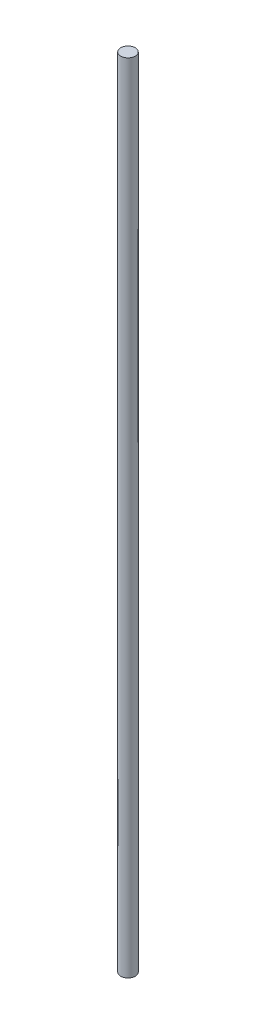
ISO-10303-21;
HEADER;
FILE_DESCRIPTION(('STEP AP214'),'2;1');
FILE_NAME('part.step','',(''),(''),'','','');
FILE_SCHEMA(('AUTOMOTIVE_DESIGN { 1 0 10303 214 1 1 1 1 }'));
ENDSEC;
DATA;
#1=APPLICATION_CONTEXT('core data for automotive mechanical design processes');
#2=APPLICATION_PROTOCOL_DEFINITION('international standard','automotive_design',2000,#1);
#3=PRODUCT_CONTEXT('',#1,'mechanical');
#4=PRODUCT('Part','Part','',(#3));
#5=PRODUCT_RELATED_PRODUCT_CATEGORY('part','',(#4));
#6=PRODUCT_DEFINITION_FORMATION('','',#4);
#7=PRODUCT_DEFINITION_CONTEXT('part definition',#1,'design');
#8=PRODUCT_DEFINITION('design','',#6,#7);
#9=PRODUCT_DEFINITION_SHAPE('','',#8);
#10=(LENGTH_UNIT() NAMED_UNIT(*) SI_UNIT(.MILLI.,.METRE.));
#11=(NAMED_UNIT(*) PLANE_ANGLE_UNIT() SI_UNIT($,.RADIAN.));
#12=(NAMED_UNIT(*) SI_UNIT($,.STERADIAN.) SOLID_ANGLE_UNIT());
#13=UNCERTAINTY_MEASURE_WITH_UNIT(LENGTH_MEASURE(1.E-05),#10,'distance_accuracy_value','');
#14=(GEOMETRIC_REPRESENTATION_CONTEXT(3) GLOBAL_UNCERTAINTY_ASSIGNED_CONTEXT((#13)) GLOBAL_UNIT_ASSIGNED_CONTEXT((#10,
#11,#12)) REPRESENTATION_CONTEXT('',''));
#15=CARTESIAN_POINT('',(0.,0.,0.));
#16=DIRECTION('',(0.,0.,1.));
#17=DIRECTION('',(1.,0.,0.));
#18=AXIS2_PLACEMENT_3D('',#15,#16,#17);
#19=CARTESIAN_POINT('',(0.,274.2,0.));
#20=DIRECTION('',(0.,-1.,0.));
#21=DIRECTION('',(0.,0.,-1.));
#22=AXIS2_PLACEMENT_3D('',#19,#20,#21);
#23=CYLINDRICAL_SURFACE('',#22,2.5);
#24=CARTESIAN_POINT('',(0.,274.2,0.));
#25=DIRECTION('',(0.,1.,0.));
#26=DIRECTION('',(0.,0.,1.));
#27=AXIS2_PLACEMENT_3D('',#24,#25,#26);
#28=CIRCLE('',#27,2.5);
#29=CARTESIAN_POINT('',(0.,274.2,2.5));
#30=VERTEX_POINT('',#29);
#31=EDGE_CURVE('E10',#30,#30,#28,.T.);
#32=ORIENTED_EDGE('',*,*,#31,.F.);
#33=EDGE_LOOP('',(#32));
#34=FACE_BOUND('',#33,.T.);
#35=CARTESIAN_POINT('',(0.,0.,0.));
#36=DIRECTION('',(0.,1.,0.));
#37=DIRECTION('',(0.,0.,1.));
#38=AXIS2_PLACEMENT_3D('',#35,#36,#37);
#39=CIRCLE('',#38,2.5);
#40=CARTESIAN_POINT('',(0.,0.,2.5));
#41=VERTEX_POINT('',#40);
#42=EDGE_CURVE('E36',#41,#41,#39,.T.);
#43=ORIENTED_EDGE('',*,*,#42,.T.);
#44=EDGE_LOOP('',(#43));
#45=FACE_BOUND('',#44,.T.);
#46=ADVANCED_FACE('F33',(#34,#45),#23,.T.);
#47=CARTESIAN_POINT('',(0.,274.2,0.));
#48=DIRECTION('',(0.,1.,0.));
#49=DIRECTION('',(0.,0.,1.));
#50=AXIS2_PLACEMENT_3D('',#47,#48,#49);
#51=PLANE('',#50);
#52=ORIENTED_EDGE('',*,*,#31,.T.);
#53=EDGE_LOOP('',(#52));
#54=FACE_BOUND('',#53,.T.);
#55=ADVANCED_FACE('F48',(#54),#51,.T.);
#56=CARTESIAN_POINT('',(0.,0.,0.));
#57=DIRECTION('',(0.,1.,0.));
#58=DIRECTION('',(0.,0.,1.));
#59=AXIS2_PLACEMENT_3D('',#56,#57,#58);
#60=PLANE('',#59);
#61=ORIENTED_EDGE('',*,*,#42,.F.);
#62=EDGE_LOOP('',(#61));
#63=FACE_BOUND('',#62,.T.);
#64=ADVANCED_FACE('F46',(#63),#60,.F.);
#65=CLOSED_SHELL('',(#46,#55,#64));
#66=MANIFOLD_SOLID_BREP('B2',#65);
#67=ADVANCED_BREP_SHAPE_REPRESENTATION('',(#18,#66),#14);
#68=SHAPE_DEFINITION_REPRESENTATION(#9,#67);
ENDSEC;
END-ISO-10303-21;
